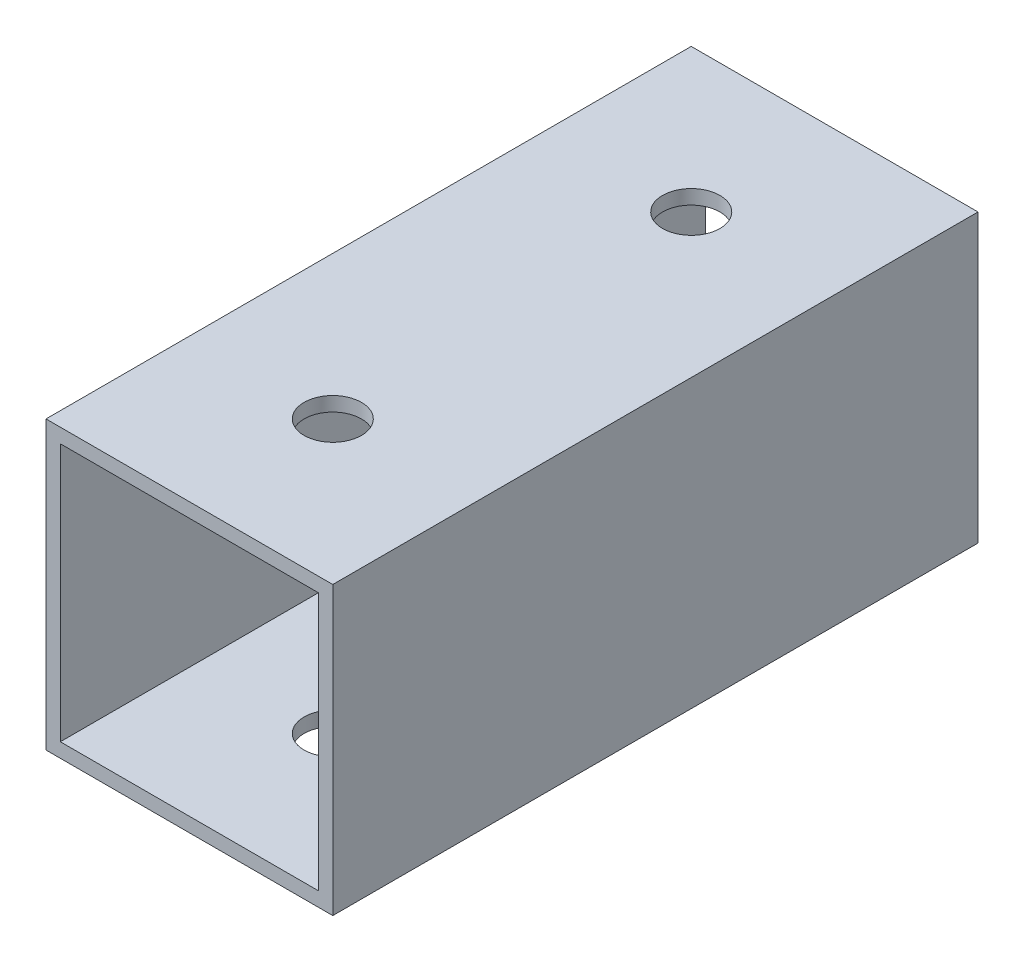
ISO-10303-21;
HEADER;
FILE_DESCRIPTION(('STEP AP214'),'2;1');
FILE_NAME('part.step','',(''),(''),'','','');
FILE_SCHEMA(('AUTOMOTIVE_DESIGN { 1 0 10303 214 1 1 1 1 }'));
ENDSEC;
DATA;
#1=APPLICATION_CONTEXT('core data for automotive mechanical design processes');
#2=APPLICATION_PROTOCOL_DEFINITION('international standard','automotive_design',2000,#1);
#3=PRODUCT_CONTEXT('',#1,'mechanical');
#4=PRODUCT('Part','Part','',(#3));
#5=PRODUCT_RELATED_PRODUCT_CATEGORY('part','',(#4));
#6=PRODUCT_DEFINITION_FORMATION('','',#4);
#7=PRODUCT_DEFINITION_CONTEXT('part definition',#1,'design');
#8=PRODUCT_DEFINITION('design','',#6,#7);
#9=PRODUCT_DEFINITION_SHAPE('','',#8);
#10=(LENGTH_UNIT() NAMED_UNIT(*) SI_UNIT(.MILLI.,.METRE.));
#11=(NAMED_UNIT(*) PLANE_ANGLE_UNIT() SI_UNIT($,.RADIAN.));
#12=(NAMED_UNIT(*) SI_UNIT($,.STERADIAN.) SOLID_ANGLE_UNIT());
#13=UNCERTAINTY_MEASURE_WITH_UNIT(LENGTH_MEASURE(1.E-05),#10,'distance_accuracy_value','');
#14=(GEOMETRIC_REPRESENTATION_CONTEXT(3) GLOBAL_UNCERTAINTY_ASSIGNED_CONTEXT((#13)) GLOBAL_UNIT_ASSIGNED_CONTEXT((#10,
#11,#12)) REPRESENTATION_CONTEXT('',''));
#15=CARTESIAN_POINT('',(0.,0.,0.));
#16=DIRECTION('',(0.,0.,1.));
#17=DIRECTION('',(1.,0.,0.));
#18=AXIS2_PLACEMENT_3D('',#15,#16,#17);
#19=CARTESIAN_POINT('',(0.,0.,45.));
#20=DIRECTION('',(0.,0.,1.));
#21=DIRECTION('',(1.,0.,0.));
#22=AXIS2_PLACEMENT_3D('',#19,#20,#21);
#23=PLANE('',#22);
#24=DIRECTION('',(0.,1.,0.));
#25=VECTOR('',#24,1.);
#26=CARTESIAN_POINT('',(10.,10.,45.));
#27=LINE('',#26,#25);
#28=CARTESIAN_POINT('',(10.,-10.,45.));
#29=VERTEX_POINT('',#28);
#30=CARTESIAN_POINT('',(10.,10.,45.));
#31=VERTEX_POINT('',#30);
#32=EDGE_CURVE('E161',#29,#31,#27,.T.);
#33=ORIENTED_EDGE('',*,*,#32,.T.);
#34=DIRECTION('',(-1.,0.,0.));
#35=VECTOR('',#34,1.);
#36=CARTESIAN_POINT('',(-10.,10.,45.));
#37=LINE('',#36,#35);
#38=CARTESIAN_POINT('',(-10.,10.,45.));
#39=VERTEX_POINT('',#38);
#40=EDGE_CURVE('E164',#31,#39,#37,.T.);
#41=ORIENTED_EDGE('',*,*,#40,.T.);
#42=DIRECTION('',(0.,-1.,0.));
#43=VECTOR('',#42,1.);
#44=CARTESIAN_POINT('',(-10.,10.,45.));
#45=LINE('',#44,#43);
#46=CARTESIAN_POINT('',(-10.,-10.,45.));
#47=VERTEX_POINT('',#46);
#48=EDGE_CURVE('E166',#39,#47,#45,.T.);
#49=ORIENTED_EDGE('',*,*,#48,.T.);
#50=DIRECTION('',(1.,0.,0.));
#51=VECTOR('',#50,1.);
#52=CARTESIAN_POINT('',(-10.,-10.,45.));
#53=LINE('',#52,#51);
#54=EDGE_CURVE('E174',#47,#29,#53,.T.);
#55=ORIENTED_EDGE('',*,*,#54,.T.);
#56=EDGE_LOOP('',(#33,#41,#49,#55));
#57=FACE_BOUND('',#56,.T.);
#58=DIRECTION('',(-1.,0.,0.));
#59=VECTOR('',#58,1.);
#60=CARTESIAN_POINT('',(-9.00000000000001,9.,45.));
#61=LINE('',#60,#59);
#62=CARTESIAN_POINT('',(9.,9.,45.));
#63=VERTEX_POINT('',#62);
#64=CARTESIAN_POINT('',(-9.00000000000001,9.,45.));
#65=VERTEX_POINT('',#64);
#66=EDGE_CURVE('E116',#63,#65,#61,.T.);
#67=ORIENTED_EDGE('',*,*,#66,.F.);
#68=DIRECTION('',(0.,1.,0.));
#69=VECTOR('',#68,1.);
#70=CARTESIAN_POINT('',(9.,9.,45.));
#71=LINE('',#70,#69);
#72=CARTESIAN_POINT('',(9.,-9.,45.));
#73=VERTEX_POINT('',#72);
#74=EDGE_CURVE('E112',#73,#63,#71,.T.);
#75=ORIENTED_EDGE('',*,*,#74,.F.);
#76=DIRECTION('',(1.,0.,0.));
#77=VECTOR('',#76,1.);
#78=CARTESIAN_POINT('',(-9.00000000000001,-9.,45.));
#79=LINE('',#78,#77);
#80=CARTESIAN_POINT('',(-9.00000000000001,-9.,45.));
#81=VERTEX_POINT('',#80);
#82=EDGE_CURVE('E140',#81,#73,#79,.T.);
#83=ORIENTED_EDGE('',*,*,#82,.F.);
#84=DIRECTION('',(0.,-1.,0.));
#85=VECTOR('',#84,1.);
#86=CARTESIAN_POINT('',(-9.00000000000001,9.,45.));
#87=LINE('',#86,#85);
#88=EDGE_CURVE('E132',#65,#81,#87,.T.);
#89=ORIENTED_EDGE('',*,*,#88,.F.);
#90=EDGE_LOOP('',(#67,#75,#83,#89));
#91=FACE_BOUND('',#90,.T.);
#92=ADVANCED_FACE('F43',(#57,#91),#23,.T.);
#93=CARTESIAN_POINT('',(0.,0.,0.));
#94=DIRECTION('',(0.,0.,1.));
#95=DIRECTION('',(1.,0.,0.));
#96=AXIS2_PLACEMENT_3D('',#93,#94,#95);
#97=PLANE('',#96);
#98=DIRECTION('',(0.,1.,0.));
#99=VECTOR('',#98,1.);
#100=CARTESIAN_POINT('',(10.,10.,0.));
#101=LINE('',#100,#99);
#102=CARTESIAN_POINT('',(10.,-10.,0.));
#103=VERTEX_POINT('',#102);
#104=CARTESIAN_POINT('',(10.,10.,0.));
#105=VERTEX_POINT('',#104);
#106=EDGE_CURVE('E129',#103,#105,#101,.T.);
#107=ORIENTED_EDGE('',*,*,#106,.F.);
#108=DIRECTION('',(1.,0.,0.));
#109=VECTOR('',#108,1.);
#110=CARTESIAN_POINT('',(-10.,-10.,0.));
#111=LINE('',#110,#109);
#112=CARTESIAN_POINT('',(-10.,-10.,0.));
#113=VERTEX_POINT('',#112);
#114=EDGE_CURVE('E167',#113,#103,#111,.T.);
#115=ORIENTED_EDGE('',*,*,#114,.F.);
#116=DIRECTION('',(0.,-1.,0.));
#117=VECTOR('',#116,1.);
#118=CARTESIAN_POINT('',(-10.,10.,0.));
#119=LINE('',#118,#117);
#120=CARTESIAN_POINT('',(-10.,10.,0.));
#121=VERTEX_POINT('',#120);
#122=EDGE_CURVE('E185',#121,#113,#119,.T.);
#123=ORIENTED_EDGE('',*,*,#122,.F.);
#124=DIRECTION('',(-1.,0.,0.));
#125=VECTOR('',#124,1.);
#126=CARTESIAN_POINT('',(-10.,10.,0.));
#127=LINE('',#126,#125);
#128=EDGE_CURVE('E176',#105,#121,#127,.T.);
#129=ORIENTED_EDGE('',*,*,#128,.F.);
#130=EDGE_LOOP('',(#107,#115,#123,#129));
#131=FACE_BOUND('',#130,.T.);
#132=DIRECTION('',(0.,1.,0.));
#133=VECTOR('',#132,1.);
#134=CARTESIAN_POINT('',(9.,9.,0.));
#135=LINE('',#134,#133);
#136=CARTESIAN_POINT('',(9.,-9.,0.));
#137=VERTEX_POINT('',#136);
#138=CARTESIAN_POINT('',(9.,9.,0.));
#139=VERTEX_POINT('',#138);
#140=EDGE_CURVE('E66',#137,#139,#135,.T.);
#141=ORIENTED_EDGE('',*,*,#140,.T.);
#142=DIRECTION('',(-1.,0.,0.));
#143=VECTOR('',#142,1.);
#144=CARTESIAN_POINT('',(-9.00000000000001,9.,0.));
#145=LINE('',#144,#143);
#146=CARTESIAN_POINT('',(-9.00000000000001,9.,0.));
#147=VERTEX_POINT('',#146);
#148=EDGE_CURVE('E130',#139,#147,#145,.T.);
#149=ORIENTED_EDGE('',*,*,#148,.T.);
#150=DIRECTION('',(0.,-1.,0.));
#151=VECTOR('',#150,1.);
#152=CARTESIAN_POINT('',(-9.00000000000001,9.,0.));
#153=LINE('',#152,#151);
#154=CARTESIAN_POINT('',(-9.00000000000001,-9.,0.));
#155=VERTEX_POINT('',#154);
#156=EDGE_CURVE('E146',#147,#155,#153,.T.);
#157=ORIENTED_EDGE('',*,*,#156,.T.);
#158=DIRECTION('',(1.,0.,0.));
#159=VECTOR('',#158,1.);
#160=CARTESIAN_POINT('',(-9.00000000000001,-9.,0.));
#161=LINE('',#160,#159);
#162=EDGE_CURVE('E122',#155,#137,#161,.T.);
#163=ORIENTED_EDGE('',*,*,#162,.T.);
#164=EDGE_LOOP('',(#141,#149,#157,#163));
#165=FACE_BOUND('',#164,.T.);
#166=ADVANCED_FACE('F243',(#131,#165),#97,.F.);
#167=CARTESIAN_POINT('',(10.,10.,45.));
#168=DIRECTION('',(-1.,0.,0.));
#169=DIRECTION('',(0.,0.,1.));
#170=AXIS2_PLACEMENT_3D('',#167,#168,#169);
#171=PLANE('',#170);
#172=ORIENTED_EDGE('',*,*,#106,.T.);
#173=DIRECTION('',(0.,0.,-1.));
#174=VECTOR('',#173,1.);
#175=CARTESIAN_POINT('',(10.,10.,45.));
#176=LINE('',#175,#174);
#177=EDGE_CURVE('E11',#31,#105,#176,.T.);
#178=ORIENTED_EDGE('',*,*,#177,.F.);
#179=ORIENTED_EDGE('',*,*,#32,.F.);
#180=DIRECTION('',(0.,0.,-1.));
#181=VECTOR('',#180,1.);
#182=CARTESIAN_POINT('',(10.,-10.,45.));
#183=LINE('',#182,#181);
#184=EDGE_CURVE('E171',#29,#103,#183,.T.);
#185=ORIENTED_EDGE('',*,*,#184,.T.);
#186=EDGE_LOOP('',(#172,#178,#179,#185));
#187=FACE_BOUND('',#186,.T.);
#188=ADVANCED_FACE('F44',(#187),#171,.F.);
#189=CARTESIAN_POINT('',(-10.,10.,45.));
#190=DIRECTION('',(0.,-1.,0.));
#191=DIRECTION('',(0.,0.,-1.));
#192=AXIS2_PLACEMENT_3D('',#189,#190,#191);
#193=PLANE('',#192);
#194=CARTESIAN_POINT('',(0.,10.,9.99999999999999));
#195=DIRECTION('',(0.,1.,0.));
#196=DIRECTION('',(0.,0.,1.));
#197=AXIS2_PLACEMENT_3D('',#194,#195,#196);
#198=CIRCLE('',#197,2.);
#199=CARTESIAN_POINT('',(0.,10.,12.));
#200=VERTEX_POINT('',#199);
#201=EDGE_CURVE('E208',#200,#200,#198,.T.);
#202=ORIENTED_EDGE('',*,*,#201,.F.);
#203=EDGE_LOOP('',(#202));
#204=FACE_BOUND('',#203,.T.);
#205=CARTESIAN_POINT('',(0.,10.,35.));
#206=DIRECTION('',(0.,1.,0.));
#207=DIRECTION('',(0.,0.,1.));
#208=AXIS2_PLACEMENT_3D('',#205,#206,#207);
#209=CIRCLE('',#208,2.);
#210=CARTESIAN_POINT('',(0.,10.,37.));
#211=VERTEX_POINT('',#210);
#212=EDGE_CURVE('E212',#211,#211,#209,.T.);
#213=ORIENTED_EDGE('',*,*,#212,.F.);
#214=EDGE_LOOP('',(#213));
#215=FACE_BOUND('',#214,.T.);
#216=ORIENTED_EDGE('',*,*,#128,.T.);
#217=DIRECTION('',(0.,0.,-1.));
#218=VECTOR('',#217,1.);
#219=CARTESIAN_POINT('',(-10.,10.,45.));
#220=LINE('',#219,#218);
#221=EDGE_CURVE('E52',#39,#121,#220,.T.);
#222=ORIENTED_EDGE('',*,*,#221,.F.);
#223=ORIENTED_EDGE('',*,*,#40,.F.);
#224=ORIENTED_EDGE('',*,*,#177,.T.);
#225=EDGE_LOOP('',(#216,#222,#223,#224));
#226=FACE_BOUND('',#225,.T.);
#227=ADVANCED_FACE('F268',(#204,#215,#226),#193,.F.);
#228=CARTESIAN_POINT('',(-10.,10.,45.));
#229=DIRECTION('',(1.,0.,0.));
#230=DIRECTION('',(0.,1.,0.));
#231=AXIS2_PLACEMENT_3D('',#228,#229,#230);
#232=PLANE('',#231);
#233=ORIENTED_EDGE('',*,*,#122,.T.);
#234=DIRECTION('',(0.,0.,-1.));
#235=VECTOR('',#234,1.);
#236=CARTESIAN_POINT('',(-10.,-10.,45.));
#237=LINE('',#236,#235);
#238=EDGE_CURVE('E186',#47,#113,#237,.T.);
#239=ORIENTED_EDGE('',*,*,#238,.F.);
#240=ORIENTED_EDGE('',*,*,#48,.F.);
#241=ORIENTED_EDGE('',*,*,#221,.T.);
#242=EDGE_LOOP('',(#233,#239,#240,#241));
#243=FACE_BOUND('',#242,.T.);
#244=ADVANCED_FACE('F264',(#243),#232,.F.);
#245=CARTESIAN_POINT('',(-10.,-10.,45.));
#246=DIRECTION('',(0.,1.,0.));
#247=DIRECTION('',(0.,0.,1.));
#248=AXIS2_PLACEMENT_3D('',#245,#246,#247);
#249=PLANE('',#248);
#250=CARTESIAN_POINT('',(0.,-10.,9.99999999999999));
#251=DIRECTION('',(0.,1.,0.));
#252=DIRECTION('',(0.,0.,1.));
#253=AXIS2_PLACEMENT_3D('',#250,#251,#252);
#254=CIRCLE('',#253,2.);
#255=CARTESIAN_POINT('',(0.,-10.,12.));
#256=VERTEX_POINT('',#255);
#257=EDGE_CURVE('E199',#256,#256,#254,.F.);
#258=ORIENTED_EDGE('',*,*,#257,.F.);
#259=EDGE_LOOP('',(#258));
#260=FACE_BOUND('',#259,.T.);
#261=CARTESIAN_POINT('',(0.,-10.,35.));
#262=DIRECTION('',(0.,1.,0.));
#263=DIRECTION('',(0.,0.,1.));
#264=AXIS2_PLACEMENT_3D('',#261,#262,#263);
#265=CIRCLE('',#264,2.);
#266=CARTESIAN_POINT('',(0.,-10.,37.));
#267=VERTEX_POINT('',#266);
#268=EDGE_CURVE('E220',#267,#267,#265,.F.);
#269=ORIENTED_EDGE('',*,*,#268,.F.);
#270=EDGE_LOOP('',(#269));
#271=FACE_BOUND('',#270,.T.);
#272=ORIENTED_EDGE('',*,*,#114,.T.);
#273=ORIENTED_EDGE('',*,*,#184,.F.);
#274=ORIENTED_EDGE('',*,*,#54,.F.);
#275=ORIENTED_EDGE('',*,*,#238,.T.);
#276=EDGE_LOOP('',(#272,#273,#274,#275));
#277=FACE_BOUND('',#276,.T.);
#278=ADVANCED_FACE('F265',(#260,#271,#277),#249,.F.);
#279=CARTESIAN_POINT('',(9.,9.,45.));
#280=DIRECTION('',(-1.,0.,0.));
#281=DIRECTION('',(0.,0.,1.));
#282=AXIS2_PLACEMENT_3D('',#279,#280,#281);
#283=PLANE('',#282);
#284=ORIENTED_EDGE('',*,*,#140,.F.);
#285=DIRECTION('',(0.,0.,-1.));
#286=VECTOR('',#285,1.);
#287=CARTESIAN_POINT('',(9.,-9.,45.));
#288=LINE('',#287,#286);
#289=EDGE_CURVE('E113',#73,#137,#288,.T.);
#290=ORIENTED_EDGE('',*,*,#289,.F.);
#291=ORIENTED_EDGE('',*,*,#74,.T.);
#292=DIRECTION('',(0.,0.,-1.));
#293=VECTOR('',#292,1.);
#294=CARTESIAN_POINT('',(9.,9.,45.));
#295=LINE('',#294,#293);
#296=EDGE_CURVE('E111',#63,#139,#295,.T.);
#297=ORIENTED_EDGE('',*,*,#296,.T.);
#298=EDGE_LOOP('',(#284,#290,#291,#297));
#299=FACE_BOUND('',#298,.T.);
#300=ADVANCED_FACE('F114',(#299),#283,.T.);
#301=CARTESIAN_POINT('',(-9.00000000000001,9.,45.));
#302=DIRECTION('',(0.,-1.,0.));
#303=DIRECTION('',(0.,0.,-1.));
#304=AXIS2_PLACEMENT_3D('',#301,#302,#303);
#305=PLANE('',#304);
#306=CARTESIAN_POINT('',(0.,9.,9.99999999999999));
#307=DIRECTION('',(0.,-1.,0.));
#308=DIRECTION('',(0.,0.,-1.));
#309=AXIS2_PLACEMENT_3D('',#306,#307,#308);
#310=CIRCLE('',#309,2.);
#311=CARTESIAN_POINT('',(0.,9.,7.99999999999999));
#312=VERTEX_POINT('',#311);
#313=EDGE_CURVE('E144',#312,#312,#310,.T.);
#314=ORIENTED_EDGE('',*,*,#313,.F.);
#315=EDGE_LOOP('',(#314));
#316=FACE_BOUND('',#315,.T.);
#317=CARTESIAN_POINT('',(0.,9.,35.));
#318=DIRECTION('',(0.,-1.,0.));
#319=DIRECTION('',(0.,0.,-1.));
#320=AXIS2_PLACEMENT_3D('',#317,#318,#319);
#321=CIRCLE('',#320,2.);
#322=CARTESIAN_POINT('',(0.,9.,33.));
#323=VERTEX_POINT('',#322);
#324=EDGE_CURVE('E200',#323,#323,#321,.T.);
#325=ORIENTED_EDGE('',*,*,#324,.F.);
#326=EDGE_LOOP('',(#325));
#327=FACE_BOUND('',#326,.T.);
#328=ORIENTED_EDGE('',*,*,#148,.F.);
#329=ORIENTED_EDGE('',*,*,#296,.F.);
#330=ORIENTED_EDGE('',*,*,#66,.T.);
#331=DIRECTION('',(0.,0.,-1.));
#332=VECTOR('',#331,1.);
#333=CARTESIAN_POINT('',(-9.00000000000001,9.,45.));
#334=LINE('',#333,#332);
#335=EDGE_CURVE('E128',#65,#147,#334,.T.);
#336=ORIENTED_EDGE('',*,*,#335,.T.);
#337=EDGE_LOOP('',(#328,#329,#330,#336));
#338=FACE_BOUND('',#337,.T.);
#339=ADVANCED_FACE('F121',(#316,#327,#338),#305,.T.);
#340=CARTESIAN_POINT('',(-9.00000000000001,9.,45.));
#341=DIRECTION('',(1.,0.,0.));
#342=DIRECTION('',(0.,0.,-1.));
#343=AXIS2_PLACEMENT_3D('',#340,#341,#342);
#344=PLANE('',#343);
#345=ORIENTED_EDGE('',*,*,#156,.F.);
#346=ORIENTED_EDGE('',*,*,#335,.F.);
#347=ORIENTED_EDGE('',*,*,#88,.T.);
#348=DIRECTION('',(0.,0.,-1.));
#349=VECTOR('',#348,1.);
#350=CARTESIAN_POINT('',(-9.00000000000001,-9.,45.));
#351=LINE('',#350,#349);
#352=EDGE_CURVE('E63',#81,#155,#351,.T.);
#353=ORIENTED_EDGE('',*,*,#352,.T.);
#354=EDGE_LOOP('',(#345,#346,#347,#353));
#355=FACE_BOUND('',#354,.T.);
#356=ADVANCED_FACE('F240',(#355),#344,.T.);
#357=CARTESIAN_POINT('',(-9.00000000000001,-9.,45.));
#358=DIRECTION('',(0.,1.,0.));
#359=DIRECTION('',(0.,0.,1.));
#360=AXIS2_PLACEMENT_3D('',#357,#358,#359);
#361=PLANE('',#360);
#362=CARTESIAN_POINT('',(0.,-9.,9.99999999999999));
#363=DIRECTION('',(0.,1.,0.));
#364=DIRECTION('',(0.,0.,1.));
#365=AXIS2_PLACEMENT_3D('',#362,#363,#364);
#366=CIRCLE('',#365,2.);
#367=CARTESIAN_POINT('',(0.,-9.,12.));
#368=VERTEX_POINT('',#367);
#369=EDGE_CURVE('E50',#368,#368,#366,.T.);
#370=ORIENTED_EDGE('',*,*,#369,.F.);
#371=EDGE_LOOP('',(#370));
#372=FACE_BOUND('',#371,.T.);
#373=CARTESIAN_POINT('',(0.,-9.,35.));
#374=DIRECTION('',(0.,1.,0.));
#375=DIRECTION('',(0.,0.,1.));
#376=AXIS2_PLACEMENT_3D('',#373,#374,#375);
#377=CIRCLE('',#376,2.);
#378=CARTESIAN_POINT('',(0.,-9.,37.));
#379=VERTEX_POINT('',#378);
#380=EDGE_CURVE('E198',#379,#379,#377,.T.);
#381=ORIENTED_EDGE('',*,*,#380,.F.);
#382=EDGE_LOOP('',(#381));
#383=FACE_BOUND('',#382,.T.);
#384=ORIENTED_EDGE('',*,*,#162,.F.);
#385=ORIENTED_EDGE('',*,*,#352,.F.);
#386=ORIENTED_EDGE('',*,*,#82,.T.);
#387=ORIENTED_EDGE('',*,*,#289,.T.);
#388=EDGE_LOOP('',(#384,#385,#386,#387));
#389=FACE_BOUND('',#388,.T.);
#390=ADVANCED_FACE('F234',(#372,#383,#389),#361,.T.);
#391=CARTESIAN_POINT('',(0.,-15.6568542494924,35.));
#392=DIRECTION('',(0.,1.,0.));
#393=DIRECTION('',(0.,0.,1.));
#394=AXIS2_PLACEMENT_3D('',#391,#392,#393);
#395=CYLINDRICAL_SURFACE('',#394,2.);
#396=CARTESIAN_POINT('',(0.,-9.,37.));
#397=CARTESIAN_POINT('',(0.,-9.01041666666666,37.));
#398=CARTESIAN_POINT('',(0.,-9.02083333333333,37.));
#399=CARTESIAN_POINT('',(0.,-9.04166666666666,37.));
#400=CARTESIAN_POINT('',(0.,-9.05208333333333,37.));
#401=CARTESIAN_POINT('',(0.,-9.07291666666666,37.));
#402=CARTESIAN_POINT('',(0.,-9.08333333333333,37.));
#403=CARTESIAN_POINT('',(0.,-9.10416666666666,37.));
#404=CARTESIAN_POINT('',(0.,-9.11458333333333,37.));
#405=CARTESIAN_POINT('',(0.,-9.13541666666666,37.));
#406=CARTESIAN_POINT('',(0.,-9.14583333333333,37.));
#407=CARTESIAN_POINT('',(0.,-9.16666666666666,37.));
#408=CARTESIAN_POINT('',(0.,-9.17708333333333,37.));
#409=CARTESIAN_POINT('',(0.,-9.19791666666666,37.));
#410=CARTESIAN_POINT('',(0.,-9.20833333333333,37.));
#411=CARTESIAN_POINT('',(0.,-9.22916666666666,37.));
#412=CARTESIAN_POINT('',(0.,-9.23958333333333,37.));
#413=CARTESIAN_POINT('',(0.,-9.26041666666666,37.));
#414=CARTESIAN_POINT('',(0.,-9.27083333333333,37.));
#415=CARTESIAN_POINT('',(0.,-9.29166666666666,37.));
#416=CARTESIAN_POINT('',(0.,-9.30208333333333,37.));
#417=CARTESIAN_POINT('',(0.,-9.32291666666666,37.));
#418=CARTESIAN_POINT('',(0.,-9.33333333333333,37.));
#419=CARTESIAN_POINT('',(0.,-9.35416666666666,37.));
#420=CARTESIAN_POINT('',(0.,-9.36458333333333,37.));
#421=CARTESIAN_POINT('',(0.,-9.38541666666666,37.));
#422=CARTESIAN_POINT('',(0.,-9.39583333333333,37.));
#423=CARTESIAN_POINT('',(0.,-9.41666666666667,37.));
#424=CARTESIAN_POINT('',(0.,-9.42708333333333,37.));
#425=CARTESIAN_POINT('',(0.,-9.44791666666667,37.));
#426=CARTESIAN_POINT('',(0.,-9.45833333333333,37.));
#427=CARTESIAN_POINT('',(0.,-9.47916666666667,37.));
#428=CARTESIAN_POINT('',(0.,-9.48958333333333,37.));
#429=CARTESIAN_POINT('',(0.,-9.51041666666667,37.));
#430=CARTESIAN_POINT('',(0.,-9.52083333333333,37.));
#431=CARTESIAN_POINT('',(0.,-9.54166666666667,37.));
#432=CARTESIAN_POINT('',(0.,-9.55208333333333,37.));
#433=CARTESIAN_POINT('',(0.,-9.57291666666667,37.));
#434=CARTESIAN_POINT('',(0.,-9.58333333333333,37.));
#435=CARTESIAN_POINT('',(0.,-9.60416666666667,37.));
#436=CARTESIAN_POINT('',(0.,-9.61458333333333,37.));
#437=CARTESIAN_POINT('',(0.,-9.63541666666667,37.));
#438=CARTESIAN_POINT('',(0.,-9.64583333333333,37.));
#439=CARTESIAN_POINT('',(0.,-9.66666666666667,37.));
#440=CARTESIAN_POINT('',(0.,-9.67708333333333,37.));
#441=CARTESIAN_POINT('',(0.,-9.69791666666667,37.));
#442=CARTESIAN_POINT('',(0.,-9.70833333333333,37.));
#443=CARTESIAN_POINT('',(0.,-9.72916666666667,37.));
#444=CARTESIAN_POINT('',(0.,-9.73958333333333,37.));
#445=CARTESIAN_POINT('',(0.,-9.76041666666667,37.));
#446=CARTESIAN_POINT('',(0.,-9.77083333333333,37.));
#447=CARTESIAN_POINT('',(0.,-9.79166666666667,37.));
#448=CARTESIAN_POINT('',(0.,-9.80208333333333,37.));
#449=CARTESIAN_POINT('',(0.,-9.82291666666667,37.));
#450=CARTESIAN_POINT('',(0.,-9.83333333333333,37.));
#451=CARTESIAN_POINT('',(0.,-9.85416666666667,37.));
#452=CARTESIAN_POINT('',(0.,-9.86458333333333,37.));
#453=CARTESIAN_POINT('',(0.,-9.88541666666667,37.));
#454=CARTESIAN_POINT('',(0.,-9.89583333333333,37.));
#455=CARTESIAN_POINT('',(0.,-9.91666666666667,37.));
#456=CARTESIAN_POINT('',(0.,-9.92708333333333,37.));
#457=CARTESIAN_POINT('',(0.,-9.94791666666667,37.));
#458=CARTESIAN_POINT('',(0.,-9.95833333333333,37.));
#459=CARTESIAN_POINT('',(0.,-9.97916666666667,37.));
#460=CARTESIAN_POINT('',(0.,-9.98958333333333,37.));
#461=CARTESIAN_POINT('',(0.,-10.,37.));
#462=B_SPLINE_CURVE_WITH_KNOTS('',3,(#396,#397,#398,#399,#400,#401,#402,#403,#404,#405,#406,
#407,#408,#409,#410,#411,#412,#413,#414,#415,#416,#417,#418,#419,#420,#421,#422,#423,#424,#425,
#426,#427,#428,#429,#430,#431,#432,#433,#434,#435,#436,#437,#438,#439,#440,#441,#442,#443,#444,
#445,#446,#447,#448,#449,#450,#451,#452,#453,#454,#455,#456,#457,#458,#459,#460,#461),
.UNSPECIFIED.,.F.,.F.,(4,2,2,2,2,2,2,2,2,2,2,2,2,2,2,2,2,2,2,2,2,2,2,2,2,2,2,2,2,2,2,2,4),(0.,
0.03125,0.0625000000000001,0.0937500000000001,0.125,0.156250000000002,0.187500000000002,
0.218750000000002,0.250000000000002,0.281250000000002,0.312500000000002,0.343750000000002,
0.375000000000002,0.406250000000002,0.437500000000002,0.468750000000002,0.500000000000002,
0.531250000000002,0.562500000000002,0.593750000000002,0.625000000000002,0.656250000000002,
0.687500000000002,0.718750000000002,0.750000000000002,0.781250000000002,0.812500000000002,
0.843750000000002,0.875000000000004,0.906250000000004,0.937500000000004,0.968750000000004,1.),.UNSPECIFIED.);
#463=EDGE_CURVE('BSEAM237',#379,#267,#462,.T.);
#464=ORIENTED_EDGE('',*,*,#380,.T.);
#465=ORIENTED_EDGE('',*,*,#268,.T.);
#466=ORIENTED_EDGE('',*,*,#463,.T.);
#467=ORIENTED_EDGE('',*,*,#463,.F.);
#468=EDGE_LOOP('',(#464,#466,#465,#467));
#469=FACE_BOUND('',#468,.T.);
#470=ADVANCED_FACE('F237',(#469),#395,.F.);
#471=CARTESIAN_POINT('',(0.,-15.6568542494924,9.99999999999999));
#472=DIRECTION('',(0.,1.,0.));
#473=DIRECTION('',(0.,0.,1.));
#474=AXIS2_PLACEMENT_3D('',#471,#472,#473);
#475=CYLINDRICAL_SURFACE('',#474,2.);
#476=CARTESIAN_POINT('',(0.,-9.,12.));
#477=CARTESIAN_POINT('',(0.,-9.01041666666666,12.));
#478=CARTESIAN_POINT('',(0.,-9.02083333333333,12.));
#479=CARTESIAN_POINT('',(0.,-9.04166666666666,12.));
#480=CARTESIAN_POINT('',(0.,-9.05208333333333,12.));
#481=CARTESIAN_POINT('',(0.,-9.07291666666666,12.));
#482=CARTESIAN_POINT('',(0.,-9.08333333333333,12.));
#483=CARTESIAN_POINT('',(0.,-9.10416666666666,12.));
#484=CARTESIAN_POINT('',(0.,-9.11458333333333,12.));
#485=CARTESIAN_POINT('',(0.,-9.13541666666666,12.));
#486=CARTESIAN_POINT('',(0.,-9.14583333333333,12.));
#487=CARTESIAN_POINT('',(0.,-9.16666666666666,12.));
#488=CARTESIAN_POINT('',(0.,-9.17708333333333,12.));
#489=CARTESIAN_POINT('',(0.,-9.19791666666666,12.));
#490=CARTESIAN_POINT('',(0.,-9.20833333333333,12.));
#491=CARTESIAN_POINT('',(0.,-9.22916666666666,12.));
#492=CARTESIAN_POINT('',(0.,-9.23958333333333,12.));
#493=CARTESIAN_POINT('',(0.,-9.26041666666666,12.));
#494=CARTESIAN_POINT('',(0.,-9.27083333333333,12.));
#495=CARTESIAN_POINT('',(0.,-9.29166666666666,12.));
#496=CARTESIAN_POINT('',(0.,-9.30208333333333,12.));
#497=CARTESIAN_POINT('',(0.,-9.32291666666666,12.));
#498=CARTESIAN_POINT('',(0.,-9.33333333333333,12.));
#499=CARTESIAN_POINT('',(0.,-9.35416666666666,12.));
#500=CARTESIAN_POINT('',(0.,-9.36458333333333,12.));
#501=CARTESIAN_POINT('',(0.,-9.38541666666666,12.));
#502=CARTESIAN_POINT('',(0.,-9.39583333333333,12.));
#503=CARTESIAN_POINT('',(0.,-9.41666666666667,12.));
#504=CARTESIAN_POINT('',(0.,-9.42708333333333,12.));
#505=CARTESIAN_POINT('',(0.,-9.44791666666667,12.));
#506=CARTESIAN_POINT('',(0.,-9.45833333333333,12.));
#507=CARTESIAN_POINT('',(0.,-9.47916666666667,12.));
#508=CARTESIAN_POINT('',(0.,-9.48958333333333,12.));
#509=CARTESIAN_POINT('',(0.,-9.51041666666667,12.));
#510=CARTESIAN_POINT('',(0.,-9.52083333333333,12.));
#511=CARTESIAN_POINT('',(0.,-9.54166666666667,12.));
#512=CARTESIAN_POINT('',(0.,-9.55208333333333,12.));
#513=CARTESIAN_POINT('',(0.,-9.57291666666667,12.));
#514=CARTESIAN_POINT('',(0.,-9.58333333333333,12.));
#515=CARTESIAN_POINT('',(0.,-9.60416666666667,12.));
#516=CARTESIAN_POINT('',(0.,-9.61458333333333,12.));
#517=CARTESIAN_POINT('',(0.,-9.63541666666667,12.));
#518=CARTESIAN_POINT('',(0.,-9.64583333333333,12.));
#519=CARTESIAN_POINT('',(0.,-9.66666666666667,12.));
#520=CARTESIAN_POINT('',(0.,-9.67708333333333,12.));
#521=CARTESIAN_POINT('',(0.,-9.69791666666667,12.));
#522=CARTESIAN_POINT('',(0.,-9.70833333333333,12.));
#523=CARTESIAN_POINT('',(0.,-9.72916666666667,12.));
#524=CARTESIAN_POINT('',(0.,-9.73958333333333,12.));
#525=CARTESIAN_POINT('',(0.,-9.76041666666667,12.));
#526=CARTESIAN_POINT('',(0.,-9.77083333333333,12.));
#527=CARTESIAN_POINT('',(0.,-9.79166666666667,12.));
#528=CARTESIAN_POINT('',(0.,-9.80208333333333,12.));
#529=CARTESIAN_POINT('',(0.,-9.82291666666667,12.));
#530=CARTESIAN_POINT('',(0.,-9.83333333333333,12.));
#531=CARTESIAN_POINT('',(0.,-9.85416666666667,12.));
#532=CARTESIAN_POINT('',(0.,-9.86458333333333,12.));
#533=CARTESIAN_POINT('',(0.,-9.88541666666667,12.));
#534=CARTESIAN_POINT('',(0.,-9.89583333333333,12.));
#535=CARTESIAN_POINT('',(0.,-9.91666666666667,12.));
#536=CARTESIAN_POINT('',(0.,-9.92708333333333,12.));
#537=CARTESIAN_POINT('',(0.,-9.94791666666667,12.));
#538=CARTESIAN_POINT('',(0.,-9.95833333333333,12.));
#539=CARTESIAN_POINT('',(0.,-9.97916666666667,12.));
#540=CARTESIAN_POINT('',(0.,-9.98958333333333,12.));
#541=CARTESIAN_POINT('',(0.,-10.,12.));
#542=B_SPLINE_CURVE_WITH_KNOTS('',3,(#476,#477,#478,#479,#480,#481,#482,#483,#484,#485,#486,
#487,#488,#489,#490,#491,#492,#493,#494,#495,#496,#497,#498,#499,#500,#501,#502,#503,#504,#505,
#506,#507,#508,#509,#510,#511,#512,#513,#514,#515,#516,#517,#518,#519,#520,#521,#522,#523,#524,
#525,#526,#527,#528,#529,#530,#531,#532,#533,#534,#535,#536,#537,#538,#539,#540,#541),
.UNSPECIFIED.,.F.,.F.,(4,2,2,2,2,2,2,2,2,2,2,2,2,2,2,2,2,2,2,2,2,2,2,2,2,2,2,2,2,2,2,2,4),(0.,
0.03125,0.0625000000000001,0.0937500000000001,0.125,0.156250000000002,0.187500000000002,
0.218750000000002,0.250000000000002,0.281250000000002,0.312500000000002,0.343750000000002,
0.375000000000002,0.406250000000002,0.437500000000002,0.468750000000002,0.500000000000002,
0.531250000000002,0.562500000000002,0.593750000000002,0.625000000000002,0.656250000000002,
0.687500000000002,0.718750000000002,0.750000000000002,0.781250000000002,0.812500000000002,
0.843750000000002,0.875000000000004,0.906250000000004,0.937500000000004,0.968750000000004,1.),.UNSPECIFIED.);
#543=EDGE_CURVE('BSEAM232',#368,#256,#542,.T.);
#544=ORIENTED_EDGE('',*,*,#369,.T.);
#545=ORIENTED_EDGE('',*,*,#257,.T.);
#546=ORIENTED_EDGE('',*,*,#543,.T.);
#547=ORIENTED_EDGE('',*,*,#543,.F.);
#548=EDGE_LOOP('',(#544,#546,#545,#547));
#549=FACE_BOUND('',#548,.T.);
#550=ADVANCED_FACE('F232',(#549),#475,.F.);
#551=ORIENTED_EDGE('',*,*,#324,.T.);
#552=EDGE_LOOP('',(#551));
#553=FACE_BOUND('',#552,.T.);
#554=ORIENTED_EDGE('',*,*,#212,.T.);
#555=EDGE_LOOP('',(#554));
#556=FACE_BOUND('',#555,.T.);
#557=ADVANCED_FACE('F292',(#553,#556),#395,.F.);
#558=ORIENTED_EDGE('',*,*,#313,.T.);
#559=EDGE_LOOP('',(#558));
#560=FACE_BOUND('',#559,.T.);
#561=ORIENTED_EDGE('',*,*,#201,.T.);
#562=EDGE_LOOP('',(#561));
#563=FACE_BOUND('',#562,.T.);
#564=ADVANCED_FACE('F291',(#560,#563),#475,.F.);
#565=CLOSED_SHELL('',(#92,#166,#188,#227,#244,#278,#300,#339,#356,#390,#470,#550,#557,#564));
#566=MANIFOLD_SOLID_BREP('B2',#565);
#567=ADVANCED_BREP_SHAPE_REPRESENTATION('',(#18,#566),#14);
#568=SHAPE_DEFINITION_REPRESENTATION(#9,#567);
ENDSEC;
END-ISO-10303-21;
